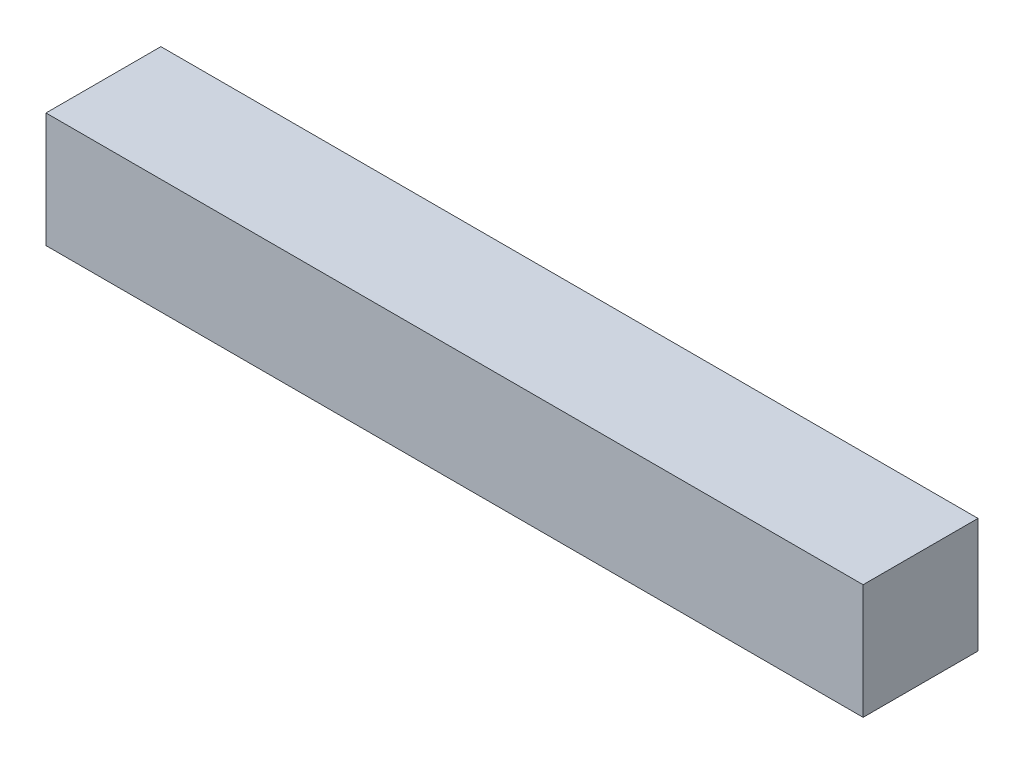
ISO-10303-21;
HEADER;
FILE_DESCRIPTION(('STEP AP214'),'2;1');
FILE_NAME('part.step','',(''),(''),'','','');
FILE_SCHEMA(('AUTOMOTIVE_DESIGN { 1 0 10303 214 1 1 1 1 }'));
ENDSEC;
DATA;
#1=APPLICATION_CONTEXT('core data for automotive mechanical design processes');
#2=APPLICATION_PROTOCOL_DEFINITION('international standard','automotive_design',2000,#1);
#3=PRODUCT_CONTEXT('',#1,'mechanical');
#4=PRODUCT('Part','Part','',(#3));
#5=PRODUCT_RELATED_PRODUCT_CATEGORY('part','',(#4));
#6=PRODUCT_DEFINITION_FORMATION('','',#4);
#7=PRODUCT_DEFINITION_CONTEXT('part definition',#1,'design');
#8=PRODUCT_DEFINITION('design','',#6,#7);
#9=PRODUCT_DEFINITION_SHAPE('','',#8);
#10=(LENGTH_UNIT() NAMED_UNIT(*) SI_UNIT(.MILLI.,.METRE.));
#11=(NAMED_UNIT(*) PLANE_ANGLE_UNIT() SI_UNIT($,.RADIAN.));
#12=(NAMED_UNIT(*) SI_UNIT($,.STERADIAN.) SOLID_ANGLE_UNIT());
#13=UNCERTAINTY_MEASURE_WITH_UNIT(LENGTH_MEASURE(1.E-05),#10,'distance_accuracy_value','');
#14=(GEOMETRIC_REPRESENTATION_CONTEXT(3) GLOBAL_UNCERTAINTY_ASSIGNED_CONTEXT((#13)) GLOBAL_UNIT_ASSIGNED_CONTEXT((#10,
#11,#12)) REPRESENTATION_CONTEXT('',''));
#15=CARTESIAN_POINT('',(0.,0.,0.));
#16=DIRECTION('',(0.,0.,1.));
#17=DIRECTION('',(1.,0.,0.));
#18=AXIS2_PLACEMENT_3D('',#15,#16,#17);
#19=CARTESIAN_POINT('',(-12.7,215.5,25.));
#20=DIRECTION('',(-1.,0.,0.));
#21=DIRECTION('',(0.,0.,1.));
#22=AXIS2_PLACEMENT_3D('',#19,#20,#21);
#23=PLANE('',#22);
#24=DIRECTION('',(0.,1.,0.));
#25=VECTOR('',#24,1.);
#26=CARTESIAN_POINT('',(-12.7,215.5,0.));
#27=LINE('',#26,#25);
#28=CARTESIAN_POINT('',(-12.7,190.5,0.));
#29=VERTEX_POINT('',#28);
#30=CARTESIAN_POINT('',(-12.7,215.5,0.));
#31=VERTEX_POINT('',#30);
#32=EDGE_CURVE('E102',#29,#31,#27,.T.);
#33=ORIENTED_EDGE('',*,*,#32,.T.);
#34=DIRECTION('',(0.,0.,-1.));
#35=VECTOR('',#34,1.);
#36=CARTESIAN_POINT('',(-12.7,215.5,25.));
#37=LINE('',#36,#35);
#38=CARTESIAN_POINT('',(-12.7,215.5,25.));
#39=VERTEX_POINT('',#38);
#40=EDGE_CURVE('E11',#39,#31,#37,.T.);
#41=ORIENTED_EDGE('',*,*,#40,.F.);
#42=DIRECTION('',(0.,1.,0.));
#43=VECTOR('',#42,1.);
#44=CARTESIAN_POINT('',(-12.7,215.5,25.));
#45=LINE('',#44,#43);
#46=CARTESIAN_POINT('',(-12.7,190.5,25.));
#47=VERTEX_POINT('',#46);
#48=EDGE_CURVE('E90',#47,#39,#45,.T.);
#49=ORIENTED_EDGE('',*,*,#48,.F.);
#50=DIRECTION('',(0.,0.,-1.));
#51=VECTOR('',#50,1.);
#52=CARTESIAN_POINT('',(-12.7,190.5,25.));
#53=LINE('',#52,#51);
#54=EDGE_CURVE('E98',#47,#29,#53,.T.);
#55=ORIENTED_EDGE('',*,*,#54,.T.);
#56=EDGE_LOOP('',(#33,#41,#49,#55));
#57=FACE_BOUND('',#56,.T.);
#58=ADVANCED_FACE('F39',(#57),#23,.F.);
#59=CARTESIAN_POINT('',(-12.7,215.5,25.));
#60=DIRECTION('',(0.,-1.,0.));
#61=DIRECTION('',(0.,0.,-1.));
#62=AXIS2_PLACEMENT_3D('',#59,#60,#61);
#63=PLANE('',#62);
#64=DIRECTION('',(-1.,0.,0.));
#65=VECTOR('',#64,1.);
#66=CARTESIAN_POINT('',(-12.7,215.5,0.));
#67=LINE('',#66,#65);
#68=CARTESIAN_POINT('',(-190.5,215.5,0.));
#69=VERTEX_POINT('',#68);
#70=EDGE_CURVE('E94',#31,#69,#67,.T.);
#71=ORIENTED_EDGE('',*,*,#70,.T.);
#72=DIRECTION('',(0.,0.,-1.));
#73=VECTOR('',#72,1.);
#74=CARTESIAN_POINT('',(-190.5,215.5,25.));
#75=LINE('',#74,#73);
#76=CARTESIAN_POINT('',(-190.5,215.5,25.));
#77=VERTEX_POINT('',#76);
#78=EDGE_CURVE('E47',#77,#69,#75,.T.);
#79=ORIENTED_EDGE('',*,*,#78,.F.);
#80=DIRECTION('',(-1.,0.,0.));
#81=VECTOR('',#80,1.);
#82=CARTESIAN_POINT('',(-12.7,215.5,25.));
#83=LINE('',#82,#81);
#84=EDGE_CURVE('E85',#39,#77,#83,.T.);
#85=ORIENTED_EDGE('',*,*,#84,.F.);
#86=ORIENTED_EDGE('',*,*,#40,.T.);
#87=EDGE_LOOP('',(#71,#79,#85,#86));
#88=FACE_BOUND('',#87,.T.);
#89=ADVANCED_FACE('F93',(#88),#63,.F.);
#90=CARTESIAN_POINT('',(-190.5,215.5,25.));
#91=DIRECTION('',(1.,0.,0.));
#92=DIRECTION('',(0.,0.,-1.));
#93=AXIS2_PLACEMENT_3D('',#90,#91,#92);
#94=PLANE('',#93);
#95=DIRECTION('',(0.,-1.,0.));
#96=VECTOR('',#95,1.);
#97=CARTESIAN_POINT('',(-190.5,215.5,0.));
#98=LINE('',#97,#96);
#99=CARTESIAN_POINT('',(-190.5,190.5,0.));
#100=VERTEX_POINT('',#99);
#101=EDGE_CURVE('E72',#69,#100,#98,.T.);
#102=ORIENTED_EDGE('',*,*,#101,.T.);
#103=DIRECTION('',(0.,0.,-1.));
#104=VECTOR('',#103,1.);
#105=CARTESIAN_POINT('',(-190.5,190.5,25.));
#106=LINE('',#105,#104);
#107=CARTESIAN_POINT('',(-190.5,190.5,25.));
#108=VERTEX_POINT('',#107);
#109=EDGE_CURVE('E95',#108,#100,#106,.T.);
#110=ORIENTED_EDGE('',*,*,#109,.F.);
#111=DIRECTION('',(0.,-1.,0.));
#112=VECTOR('',#111,1.);
#113=CARTESIAN_POINT('',(-190.5,215.5,25.));
#114=LINE('',#113,#112);
#115=EDGE_CURVE('E88',#77,#108,#114,.T.);
#116=ORIENTED_EDGE('',*,*,#115,.F.);
#117=ORIENTED_EDGE('',*,*,#78,.T.);
#118=EDGE_LOOP('',(#102,#110,#116,#117));
#119=FACE_BOUND('',#118,.T.);
#120=ADVANCED_FACE('F96',(#119),#94,.F.);
#121=CARTESIAN_POINT('',(-12.7,190.5,25.));
#122=DIRECTION('',(0.,1.,0.));
#123=DIRECTION('',(0.,0.,1.));
#124=AXIS2_PLACEMENT_3D('',#121,#122,#123);
#125=PLANE('',#124);
#126=DIRECTION('',(1.,0.,0.));
#127=VECTOR('',#126,1.);
#128=CARTESIAN_POINT('',(-12.7,190.5,0.));
#129=LINE('',#128,#127);
#130=EDGE_CURVE('E78',#100,#29,#129,.T.);
#131=ORIENTED_EDGE('',*,*,#130,.T.);
#132=ORIENTED_EDGE('',*,*,#54,.F.);
#133=DIRECTION('',(1.,0.,0.));
#134=VECTOR('',#133,1.);
#135=CARTESIAN_POINT('',(-12.7,190.5,25.));
#136=LINE('',#135,#134);
#137=EDGE_CURVE('E55',#108,#47,#136,.T.);
#138=ORIENTED_EDGE('',*,*,#137,.F.);
#139=ORIENTED_EDGE('',*,*,#109,.T.);
#140=EDGE_LOOP('',(#131,#132,#138,#139));
#141=FACE_BOUND('',#140,.T.);
#142=ADVANCED_FACE('F109',(#141),#125,.F.);
#143=CARTESIAN_POINT('',(-12.7,190.5,25.));
#144=DIRECTION('',(0.,0.,-1.));
#145=DIRECTION('',(-1.,0.,0.));
#146=AXIS2_PLACEMENT_3D('',#143,#144,#145);
#147=PLANE('',#146);
#148=ORIENTED_EDGE('',*,*,#48,.T.);
#149=ORIENTED_EDGE('',*,*,#84,.T.);
#150=ORIENTED_EDGE('',*,*,#115,.T.);
#151=ORIENTED_EDGE('',*,*,#137,.T.);
#152=EDGE_LOOP('',(#148,#149,#150,#151));
#153=FACE_BOUND('',#152,.T.);
#154=ADVANCED_FACE('F86',(#153),#147,.F.);
#155=CARTESIAN_POINT('',(-12.7,190.5,0.));
#156=DIRECTION('',(0.,0.,-1.));
#157=DIRECTION('',(-1.,0.,0.));
#158=AXIS2_PLACEMENT_3D('',#155,#156,#157);
#159=PLANE('',#158);
#160=ORIENTED_EDGE('',*,*,#32,.F.);
#161=ORIENTED_EDGE('',*,*,#130,.F.);
#162=ORIENTED_EDGE('',*,*,#101,.F.);
#163=ORIENTED_EDGE('',*,*,#70,.F.);
#164=EDGE_LOOP('',(#160,#161,#162,#163));
#165=FACE_BOUND('',#164,.T.);
#166=ADVANCED_FACE('F112',(#165),#159,.T.);
#167=CLOSED_SHELL('',(#58,#89,#120,#142,#154,#166));
#168=MANIFOLD_SOLID_BREP('B2',#167);
#169=ADVANCED_BREP_SHAPE_REPRESENTATION('',(#18,#168),#14);
#170=SHAPE_DEFINITION_REPRESENTATION(#9,#169);
ENDSEC;
END-ISO-10303-21;
